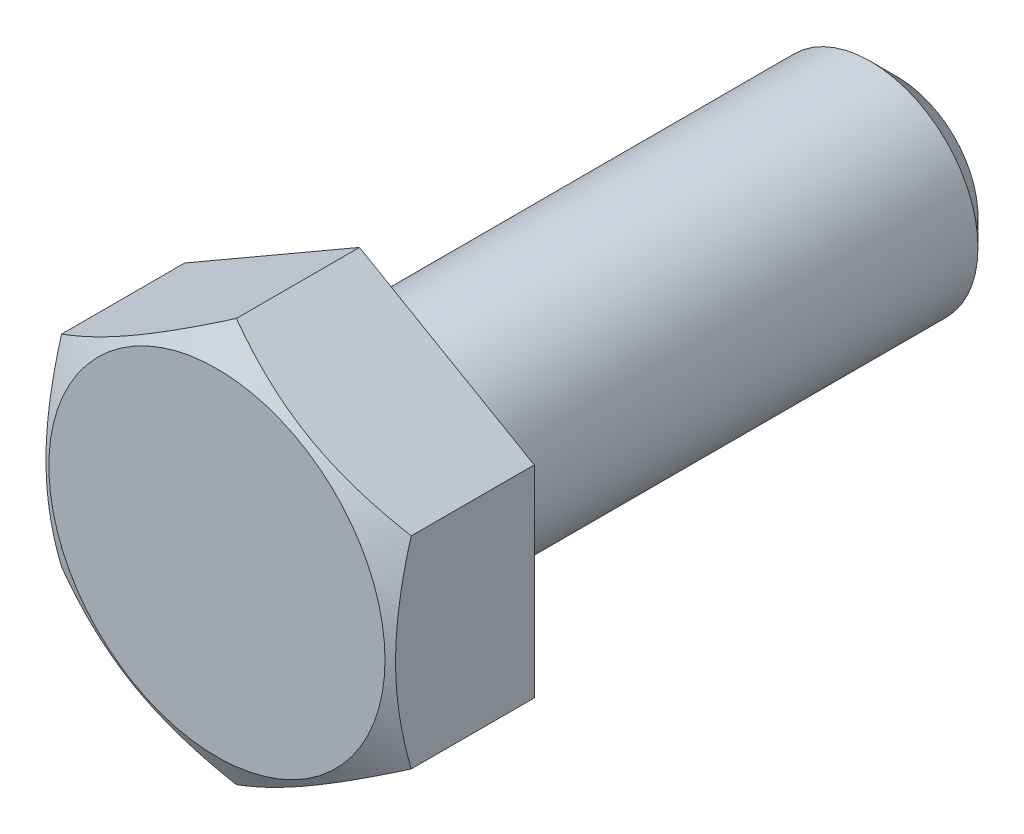
ISO-10303-21;
HEADER;
FILE_DESCRIPTION(('STEP AP214'),'2;1');
FILE_NAME('part.step','',(''),(''),'','','');
FILE_SCHEMA(('AUTOMOTIVE_DESIGN { 1 0 10303 214 1 1 1 1 }'));
ENDSEC;
DATA;
#1=APPLICATION_CONTEXT('core data for automotive mechanical design processes');
#2=APPLICATION_PROTOCOL_DEFINITION('international standard','automotive_design',2000,#1);
#3=PRODUCT_CONTEXT('',#1,'mechanical');
#4=PRODUCT('Part','Part','',(#3));
#5=PRODUCT_RELATED_PRODUCT_CATEGORY('part','',(#4));
#6=PRODUCT_DEFINITION_FORMATION('','',#4);
#7=PRODUCT_DEFINITION_CONTEXT('part definition',#1,'design');
#8=PRODUCT_DEFINITION('design','',#6,#7);
#9=PRODUCT_DEFINITION_SHAPE('','',#8);
#10=(LENGTH_UNIT() NAMED_UNIT(*) SI_UNIT(.MILLI.,.METRE.));
#11=(NAMED_UNIT(*) PLANE_ANGLE_UNIT() SI_UNIT($,.RADIAN.));
#12=(NAMED_UNIT(*) SI_UNIT($,.STERADIAN.) SOLID_ANGLE_UNIT());
#13=UNCERTAINTY_MEASURE_WITH_UNIT(LENGTH_MEASURE(1.E-05),#10,'distance_accuracy_value','');
#14=(GEOMETRIC_REPRESENTATION_CONTEXT(3) GLOBAL_UNCERTAINTY_ASSIGNED_CONTEXT((#13)) GLOBAL_UNIT_ASSIGNED_CONTEXT((#10,
#11,#12)) REPRESENTATION_CONTEXT('',''));
#15=CARTESIAN_POINT('',(0.,0.,0.));
#16=DIRECTION('',(0.,0.,1.));
#17=DIRECTION('',(1.,0.,0.));
#18=AXIS2_PLACEMENT_3D('',#15,#16,#17);
#19=CARTESIAN_POINT('',(0.,0.,0.));
#20=DIRECTION('',(0.,0.,1.));
#21=DIRECTION('',(1.,0.,0.));
#22=AXIS2_PLACEMENT_3D('',#19,#20,#21);
#23=PLANE('',#22);
#24=DIRECTION('',(-0.866025403784439,0.5,0.));
#25=VECTOR('',#24,1.);
#26=CARTESIAN_POINT('',(6.5,3.75277674973257,0.));
#27=LINE('',#26,#25);
#28=CARTESIAN_POINT('',(6.5,3.75277674973257,0.));
#29=VERTEX_POINT('',#28);
#30=CARTESIAN_POINT('',(0.,7.50555349946513,0.));
#31=VERTEX_POINT('',#30);
#32=EDGE_CURVE('E102',#29,#31,#27,.T.);
#33=ORIENTED_EDGE('',*,*,#32,.F.);
#34=DIRECTION('',(0.,1.,0.));
#35=VECTOR('',#34,1.);
#36=CARTESIAN_POINT('',(6.5,-3.75277674973257,0.));
#37=LINE('',#36,#35);
#38=CARTESIAN_POINT('',(6.5,-3.75277674973257,0.));
#39=VERTEX_POINT('',#38);
#40=EDGE_CURVE('E107',#39,#29,#37,.T.);
#41=ORIENTED_EDGE('',*,*,#40,.F.);
#42=DIRECTION('',(0.866025403784439,0.5,0.));
#43=VECTOR('',#42,1.);
#44=CARTESIAN_POINT('',(0.,-7.50555349946513,0.));
#45=LINE('',#44,#43);
#46=CARTESIAN_POINT('',(0.,-7.50555349946513,0.));
#47=VERTEX_POINT('',#46);
#48=EDGE_CURVE('E113',#47,#39,#45,.T.);
#49=ORIENTED_EDGE('',*,*,#48,.F.);
#50=DIRECTION('',(0.866025403784439,-0.5,0.));
#51=VECTOR('',#50,1.);
#52=CARTESIAN_POINT('',(-6.5,-3.75277674973257,0.));
#53=LINE('',#52,#51);
#54=CARTESIAN_POINT('',(-6.5,-3.75277674973257,0.));
#55=VERTEX_POINT('',#54);
#56=EDGE_CURVE('E224',#55,#47,#53,.T.);
#57=ORIENTED_EDGE('',*,*,#56,.F.);
#58=DIRECTION('',(0.,-1.,0.));
#59=VECTOR('',#58,1.);
#60=CARTESIAN_POINT('',(-6.5,3.75277674973257,0.));
#61=LINE('',#60,#59);
#62=CARTESIAN_POINT('',(-6.5,3.75277674973257,0.));
#63=VERTEX_POINT('',#62);
#64=EDGE_CURVE('E219',#63,#55,#61,.T.);
#65=ORIENTED_EDGE('',*,*,#64,.F.);
#66=DIRECTION('',(-0.866025403784439,-0.5,0.));
#67=VECTOR('',#66,1.);
#68=CARTESIAN_POINT('',(0.,7.50555349946513,0.));
#69=LINE('',#68,#67);
#70=EDGE_CURVE('E228',#31,#63,#69,.T.);
#71=ORIENTED_EDGE('',*,*,#70,.F.);
#72=EDGE_LOOP('',(#33,#41,#49,#57,#65,#71));
#73=FACE_BOUND('',#72,.T.);
#74=CARTESIAN_POINT('',(0.,0.,0.));
#75=DIRECTION('',(0.,0.,1.));
#76=DIRECTION('',(1.,0.,0.));
#77=AXIS2_PLACEMENT_3D('',#74,#75,#76);
#78=CIRCLE('',#77,4.);
#79=CARTESIAN_POINT('',(4.,0.,0.));
#80=VERTEX_POINT('',#79);
#81=EDGE_CURVE('E123',#80,#80,#78,.F.);
#82=ORIENTED_EDGE('',*,*,#81,.F.);
#83=EDGE_LOOP('',(#82));
#84=FACE_BOUND('',#83,.T.);
#85=ADVANCED_FACE('F39',(#73,#84),#23,.F.);
#86=CARTESIAN_POINT('',(6.5,3.75277674973257,5.3));
#87=DIRECTION('',(-0.5,-0.866025403784439,0.));
#88=DIRECTION('',(0.866025403784439,-0.5,0.));
#89=AXIS2_PLACEMENT_3D('',#86,#87,#88);
#90=PLANE('',#89);
#91=CARTESIAN_POINT('',(6.5002,3.75266127967873,4.57503918089673));
#92=CARTESIAN_POINT('',(6.35732254094112,3.8351516191275,4.62265800962711));
#93=CARTESIAN_POINT('',(6.21391236546508,3.91794952254312,4.66811573209989));
#94=CARTESIAN_POINT('',(5.9259273686828,4.08421773795795,4.75411375067955));
#95=CARTESIAN_POINT('',(5.78135207342873,4.16768832359105,4.79465192547457));
#96=CARTESIAN_POINT('',(5.34531134947996,4.41943655294051,4.90809143157939));
#97=CARTESIAN_POINT('',(5.05212471715368,4.5887079340369,4.97261462557386));
#98=CARTESIAN_POINT('',(4.61337625445562,4.84201947708215,5.0482758491551));
#99=CARTESIAN_POINT('',(4.46912536350531,4.92530276780316,5.06982957624561));
#100=CARTESIAN_POINT('',(4.17997178286191,5.09224566542477,5.10597211809648));
#101=CARTESIAN_POINT('',(4.03506915190111,5.17590523841627,5.12056154824293));
#102=CARTESIAN_POINT('',(3.74501222057168,5.34336968579964,5.14240368019525));
#103=CARTESIAN_POINT('',(3.59985839394579,5.427174286676,5.14966470838049));
#104=CARTESIAN_POINT('',(3.30942466302505,5.59485627940484,5.15670213012036));
#105=CARTESIAN_POINT('',(3.16414476276364,5.6787336689286,5.15647875489039));
#106=CARTESIAN_POINT('',(2.7661240575735,5.90853103021317,5.14557897418743));
#107=CARTESIAN_POINT('',(2.51351353897243,6.05437578112763,5.12728061483318));
#108=CARTESIAN_POINT('',(2.00997032176432,6.34509659313135,5.06925609124492));
#109=CARTESIAN_POINT('',(1.75903939406691,6.48997163178544,5.02951009416435));
#110=CARTESIAN_POINT('',(1.25448277935568,6.78127752911038,4.93015652950044));
#111=CARTESIAN_POINT('',(1.00092075856408,6.92767163007067,4.87012800706457));
#112=CARTESIAN_POINT('',(0.497578064240953,7.21827667013277,4.73388744019273));
#113=CARTESIAN_POINT('',(0.247790944447035,7.36249133098589,4.657707398539));
#114=CARTESIAN_POINT('',(-0.000200000000000559,7.50566896951897,4.57503918089673));
#115=B_SPLINE_CURVE_WITH_KNOTS('',3,(#91,#92,#93,#94,#95,#96,#97,#98,#99,#100,#101,#102,#103,
#104,#105,#106,#107,#108,#109,#110,#111,#112,#113,#114),.UNSPECIFIED.,.F.,.F.,(4,2,2,2,2,2,2,2,
2,2,2,4),(0.,0.515105052395587,1.03043143507524,2.06322554824262,2.56697389547996,
3.07067772176454,3.57380860368928,4.0769239424252,4.9527935470566,5.82947446853466,
6.72559912449736,7.61996451221045),.UNSPECIFIED.);
#116=CARTESIAN_POINT('',(6.5,3.75277674973257,4.57510584910183));
#117=VERTEX_POINT('',#116);
#118=CARTESIAN_POINT('',(0.,7.50555349946513,4.57510584910183));
#119=VERTEX_POINT('',#118);
#120=EDGE_CURVE('E93',#117,#119,#115,.T.);
#121=ORIENTED_EDGE('',*,*,#120,.F.);
#122=DIRECTION('',(0.,0.,-1.));
#123=VECTOR('',#122,1.);
#124=CARTESIAN_POINT('',(6.5,3.75277674973257,5.3));
#125=LINE('',#124,#123);
#126=EDGE_CURVE('E62',#117,#29,#125,.T.);
#127=ORIENTED_EDGE('',*,*,#126,.T.);
#128=ORIENTED_EDGE('',*,*,#32,.T.);
#129=DIRECTION('',(0.,0.,-1.));
#130=VECTOR('',#129,1.);
#131=CARTESIAN_POINT('',(0.,7.50555349946513,5.3));
#132=LINE('',#131,#130);
#133=EDGE_CURVE('E101',#119,#31,#132,.T.);
#134=ORIENTED_EDGE('',*,*,#133,.F.);
#135=EDGE_LOOP('',(#121,#127,#128,#134));
#136=FACE_BOUND('',#135,.T.);
#137=ADVANCED_FACE('F100',(#136),#90,.F.);
#138=CARTESIAN_POINT('',(0.,7.50555349946513,5.3));
#139=DIRECTION('',(0.5,-0.866025403784439,0.));
#140=DIRECTION('',(0.866025403784439,0.5,0.));
#141=AXIS2_PLACEMENT_3D('',#138,#139,#140);
#142=PLANE('',#141);
#143=CARTESIAN_POINT('',(0.000199999999999772,7.50566896951897,4.57503918089673));
#144=CARTESIAN_POINT('',(-0.142677459058881,7.4231786300702,4.62265800962711));
#145=CARTESIAN_POINT('',(-0.286087634534913,7.34038072665458,4.66811573209989));
#146=CARTESIAN_POINT('',(-0.574072631317195,7.17411251123976,4.75411375067955));
#147=CARTESIAN_POINT('',(-0.718647926571264,7.09064192560665,4.79465192547457));
#148=CARTESIAN_POINT('',(-1.15468865052003,6.83889369625719,4.90809143157939));
#149=CARTESIAN_POINT('',(-1.44787528284632,6.66962231516081,4.97261462557386));
#150=CARTESIAN_POINT('',(-1.88662374554437,6.41631077211555,5.0482758491551));
#151=CARTESIAN_POINT('',(-2.03087463649469,6.33302748139454,5.06982957624561));
#152=CARTESIAN_POINT('',(-2.32002821713809,6.16608458377293,5.10597211809648));
#153=CARTESIAN_POINT('',(-2.46493084809889,6.08242501078143,5.12056154824293));
#154=CARTESIAN_POINT('',(-2.75498777942832,5.91496056339806,5.14240368019525));
#155=CARTESIAN_POINT('',(-2.90014160605421,5.8311559625217,5.14966470838049));
#156=CARTESIAN_POINT('',(-3.19057533697495,5.66347396979287,5.15670213012036));
#157=CARTESIAN_POINT('',(-3.33585523723636,5.5795965802691,5.15647875489039));
#158=CARTESIAN_POINT('',(-3.73387594242649,5.34979921898453,5.14557897418743));
#159=CARTESIAN_POINT('',(-3.98648646102757,5.20395446807007,5.12728061483318));
#160=CARTESIAN_POINT('',(-4.49002967823568,4.91323365606636,5.06925609124492));
#161=CARTESIAN_POINT('',(-4.74096060593308,4.76835861741226,5.02951009416435));
#162=CARTESIAN_POINT('',(-5.24551722064432,4.47705272008732,4.93015652950044));
#163=CARTESIAN_POINT('',(-5.49907924143591,4.33065861912703,4.87012800706457));
#164=CARTESIAN_POINT('',(-6.00242193575904,4.04005357906494,4.73388744019273));
#165=CARTESIAN_POINT('',(-6.25220905555296,3.89583891821182,4.657707398539));
#166=CARTESIAN_POINT('',(-6.5002,3.75266127967873,4.57503918089673));
#167=B_SPLINE_CURVE_WITH_KNOTS('',3,(#143,#144,#145,#146,#147,#148,#149,#150,#151,#152,#153,
#154,#155,#156,#157,#158,#159,#160,#161,#162,#163,#164,#165,#166),.UNSPECIFIED.,.F.,.F.,(4,2,2,
2,2,2,2,2,2,2,2,4),(0.,0.515105052395588,1.03043143507524,2.06322554824262,2.56697389547996,
3.07067772176454,3.57380860368928,4.0769239424252,4.9527935470566,5.82947446853466,
6.72559912449736,7.61996451221046),.UNSPECIFIED.);
#168=CARTESIAN_POINT('',(-6.5,3.75277674973257,4.57510584910183));
#169=VERTEX_POINT('',#168);
#170=EDGE_CURVE('E103',#119,#169,#167,.T.);
#171=ORIENTED_EDGE('',*,*,#170,.F.);
#172=ORIENTED_EDGE('',*,*,#133,.T.);
#173=ORIENTED_EDGE('',*,*,#70,.T.);
#174=DIRECTION('',(0.,0.,-1.));
#175=VECTOR('',#174,1.);
#176=CARTESIAN_POINT('',(-6.5,3.75277674973257,5.3));
#177=LINE('',#176,#175);
#178=EDGE_CURVE('E120',#169,#63,#177,.T.);
#179=ORIENTED_EDGE('',*,*,#178,.F.);
#180=EDGE_LOOP('',(#171,#172,#173,#179));
#181=FACE_BOUND('',#180,.T.);
#182=ADVANCED_FACE('F144',(#181),#142,.F.);
#183=CARTESIAN_POINT('',(-6.5,3.75277674973257,5.3));
#184=DIRECTION('',(1.,0.,0.));
#185=DIRECTION('',(0.,0.,-1.));
#186=AXIS2_PLACEMENT_3D('',#183,#184,#185);
#187=PLANE('',#186);
#188=CARTESIAN_POINT('',(-6.5,-10.1964031930489,1.92711557165721));
#189=CARTESIAN_POINT('',(-6.5,-9.91146706252512,2.06579754355137));
#190=CARTESIAN_POINT('',(-6.5,-9.62588907457074,2.20318274861047));
#191=CARTESIAN_POINT('',(-6.5,-9.05310840022942,2.47463240106079));
#192=CARTESIAN_POINT('',(-6.5,-8.76590547628142,2.60869634663158));
#193=CARTESIAN_POINT('',(-6.5,-8.18810963339234,2.87342586157266));
#194=CARTESIAN_POINT('',(-6.5,-7.89750683697914,3.00406994488669));
#195=CARTESIAN_POINT('',(-6.5,-7.31402958895834,3.26016311775927));
#196=CARTESIAN_POINT('',(-6.5,-7.02115524220785,3.38561244543842));
#197=CARTESIAN_POINT('',(-6.5,-6.42287342665227,3.63401536482613));
#198=CARTESIAN_POINT('',(-6.5,-6.11737326861938,3.75674689735945));
#199=CARTESIAN_POINT('',(-6.5,-5.50284186470128,3.99319880427273));
#200=CARTESIAN_POINT('',(-6.5,-5.19381023341625,4.10691818417453));
#201=CARTESIAN_POINT('',(-6.5,-4.57226679200279,4.32244612814773));
#202=CARTESIAN_POINT('',(-6.5,-4.25976307613069,4.4242778102538));
#203=CARTESIAN_POINT('',(-6.5,-3.63027121398134,4.61283895840874));
#204=CARTESIAN_POINT('',(-6.5,-3.31328447599402,4.69957305804761));
#205=CARTESIAN_POINT('',(-6.5,-2.67639712557225,4.85340222686151));
#206=CARTESIAN_POINT('',(-6.5,-2.3565229810901,4.92060515873457));
#207=CARTESIAN_POINT('',(-6.5,-1.71263332307702,5.03162587527321));
#208=CARTESIAN_POINT('',(-6.5,-1.38861825600943,5.07544615957369));
#209=CARTESIAN_POINT('',(-6.5,-0.90293972852367,5.12073543049099));
#210=CARTESIAN_POINT('',(-6.5,-0.742189550322453,5.13241333858599));
#211=CARTESIAN_POINT('',(-6.5,-0.420332063816456,5.14896113908469));
#212=CARTESIAN_POINT('',(-6.5,-0.259224761667658,5.15383114794059));
#213=CARTESIAN_POINT('',(-6.5,0.0630511216418176,5.15663919673593));
#214=CARTESIAN_POINT('',(-6.5,0.224219703305156,5.15457717853122));
#215=CARTESIAN_POINT('',(-6.5,0.546324268949108,5.14357483116284));
#216=CARTESIAN_POINT('',(-6.5,0.707260241688987,5.1346341800386));
#217=CARTESIAN_POINT('',(-6.5,1.09049506880968,5.10534524526755));
#218=CARTESIAN_POINT('',(-6.5,1.31256476986377,5.08193031415322));
#219=CARTESIAN_POINT('',(-6.5,1.75512160628943,5.02325347502964));
#220=CARTESIAN_POINT('',(-6.5,1.97560853645986,4.98799005825506));
#221=CARTESIAN_POINT('',(-6.5,2.63439856988161,4.86629161806814));
#222=CARTESIAN_POINT('',(-6.5,3.06980900545459,4.76396766778308));
#223=CARTESIAN_POINT('',(-6.5,3.72118788096864,4.58565121984061));
#224=CARTESIAN_POINT('',(-6.5,3.94050855697565,4.5211929338711));
#225=CARTESIAN_POINT('',(-6.5,4.37702114158928,4.38536743656224));
#226=CARTESIAN_POINT('',(-6.5,4.59421303390638,4.31400017240058));
#227=CARTESIAN_POINT('',(-6.5,5.02653508607764,4.1655196367425));
#228=CARTESIAN_POINT('',(-6.5,5.24166582474598,4.08840803513156));
#229=CARTESIAN_POINT('',(-6.5,5.67012789403292,3.92936761306644));
#230=CARTESIAN_POINT('',(-6.5,5.88345926514816,3.8474389013589));
#231=CARTESIAN_POINT('',(-6.5,6.45686419323843,3.62098197309385));
#232=CARTESIAN_POINT('',(-6.5,6.81544214889601,3.4726704145426));
#233=CARTESIAN_POINT('',(-6.5,7.52892619030864,3.16743287773286));
#234=CARTESIAN_POINT('',(-6.5,7.88383187065143,3.0105059601635));
#235=CARTESIAN_POINT('',(-6.5,8.59081374128433,2.69007555499517));
#236=CARTESIAN_POINT('',(-6.5,8.94288881107286,2.52656960336644));
#237=CARTESIAN_POINT('',(-6.5,9.64464600542362,2.19455308073868));
#238=CARTESIAN_POINT('',(-6.5,9.9943282251893,2.02604271028996));
#239=CARTESIAN_POINT('',(-6.5,10.6923270252369,1.68483568484166));
#240=CARTESIAN_POINT('',(-6.5,11.0406405627199,1.51213281824188));
#241=CARTESIAN_POINT('',(-6.5,11.7357056494374,1.16361011170295));
#242=CARTESIAN_POINT('',(-6.5,12.0824571858439,0.987790246223629));
#243=CARTESIAN_POINT('',(-6.5,12.7746015421308,0.633683743777883));
#244=CARTESIAN_POINT('',(-6.5,13.1199946416679,0.455397652787269));
#245=CARTESIAN_POINT('',(-6.5,13.8097189165945,0.0967819278551111));
#246=CARTESIAN_POINT('',(-6.5,14.1540500877756,-0.0835477141718704));
#247=CARTESIAN_POINT('',(-6.5,15.1131791649223,-0.588833427630172));
#248=CARTESIAN_POINT('',(-6.5,15.7270059152904,-0.915632545673792));
#249=CARTESIAN_POINT('',(-6.5,16.9526102543151,-1.57313126938156));
#250=CARTESIAN_POINT('',(-6.5,17.5643877160335,-1.90383111113284));
#251=CARTESIAN_POINT('',(-6.5,18.7843432470106,-2.56703187359179));
#252=CARTESIAN_POINT('',(-6.5,19.3925265283063,-2.89952321614154));
#253=CARTESIAN_POINT('',(-6.5,20.6076120788137,-3.56672759971615));
#254=CARTESIAN_POINT('',(-6.5,21.2145144440943,-3.90144046571286));
#255=CARTESIAN_POINT('',(-6.5,21.8209669709978,-4.23696051415545));
#256=B_SPLINE_CURVE_WITH_KNOTS('',3,(#188,#189,#190,#191,#192,#193,#194,#195,#196,#197,#198,
#199,#200,#201,#202,#203,#204,#205,#206,#207,#208,#209,#210,#211,#212,#213,#214,#215,#216,#217,
#218,#219,#220,#221,#222,#223,#224,#225,#226,#227,#228,#229,#230,#231,#232,#233,#234,#235,#236,
#237,#238,#239,#240,#241,#242,#243,#244,#245,#246,#247,#248,#249,#250,#251,#252,#253,#254,#255),
.UNSPECIFIED.,.F.,.F.,(4,2,2,2,2,2,2,2,2,2,2,2,2,2,2,2,2,2,2,2,2,2,2,2,2,2,2,2,2,2,2,2,2,4),(0.,
0.950690619419343,1.90152401651383,2.85733928389556,3.81311068938182,4.80069533328718,
5.78838880444144,6.77412832781171,7.75956478298498,8.73945089917041,9.71923224328163,
10.2026314085953,10.6860223050466,11.1694172560735,11.6528348342104,12.3223614428188,
12.9919733400987,14.3318623515428,15.0175917928263,15.7033264772407,16.3888625899154,
17.0743832324966,18.2383326098106,19.4024091425865,20.5669257879766,21.7313958285828,
22.8977114506331,24.0640366337077,25.2301076202752,26.3961832220869,28.4823609421224,
30.5686655804134,32.6480679984329,34.7273084857545),.UNSPECIFIED.);
#257=CARTESIAN_POINT('',(-6.5,-3.75277674973257,4.57510584910183));
#258=VERTEX_POINT('',#257);
#259=EDGE_CURVE('E188',#169,#258,#256,.F.);
#260=ORIENTED_EDGE('',*,*,#259,.F.);
#261=ORIENTED_EDGE('',*,*,#178,.T.);
#262=ORIENTED_EDGE('',*,*,#64,.T.);
#263=DIRECTION('',(0.,0.,-1.));
#264=VECTOR('',#263,1.);
#265=CARTESIAN_POINT('',(-6.5,-3.75277674973257,5.3));
#266=LINE('',#265,#264);
#267=EDGE_CURVE('E118',#258,#55,#266,.T.);
#268=ORIENTED_EDGE('',*,*,#267,.F.);
#269=EDGE_LOOP('',(#260,#261,#262,#268));
#270=FACE_BOUND('',#269,.T.);
#271=ADVANCED_FACE('F199',(#270),#187,.F.);
#272=CARTESIAN_POINT('',(-6.5,-3.75277674973257,5.3));
#273=DIRECTION('',(0.5,0.866025403784439,0.));
#274=DIRECTION('',(-0.866025403784439,0.5,0.));
#275=AXIS2_PLACEMENT_3D('',#272,#273,#274);
#276=PLANE('',#275);
#277=CARTESIAN_POINT('',(-6.5002,-3.75266127967873,4.57503918089673));
#278=CARTESIAN_POINT('',(-6.35732254094112,-3.8351516191275,4.62265800962711));
#279=CARTESIAN_POINT('',(-6.21391236546509,-3.91794952254312,4.66811573209989));
#280=CARTESIAN_POINT('',(-5.9259273686828,-4.08421773795795,4.75411375067955));
#281=CARTESIAN_POINT('',(-5.78135207342873,-4.16768832359105,4.79465192547457));
#282=CARTESIAN_POINT('',(-5.34531134947996,-4.41943655294051,4.90809143157939));
#283=CARTESIAN_POINT('',(-5.05212471715368,-4.5887079340369,4.97261462557386));
#284=CARTESIAN_POINT('',(-4.61337625445563,-4.84201947708215,5.0482758491551));
#285=CARTESIAN_POINT('',(-4.46912536350531,-4.92530276780316,5.06982957624561));
#286=CARTESIAN_POINT('',(-4.17997178286191,-5.09224566542477,5.10597211809648));
#287=CARTESIAN_POINT('',(-4.03506915190111,-5.17590523841627,5.12056154824293));
#288=CARTESIAN_POINT('',(-3.74501222057168,-5.34336968579964,5.14240368019525));
#289=CARTESIAN_POINT('',(-3.59985839394579,-5.427174286676,5.14966470838049));
#290=CARTESIAN_POINT('',(-3.30942466302505,-5.59485627940484,5.15670213012036));
#291=CARTESIAN_POINT('',(-3.16414476276364,-5.6787336689286,5.15647875489039));
#292=CARTESIAN_POINT('',(-2.76612405757351,-5.90853103021317,5.14557897418743));
#293=CARTESIAN_POINT('',(-2.51351353897243,-6.05437578112763,5.12728061483318));
#294=CARTESIAN_POINT('',(-2.00997032176432,-6.34509659313134,5.06925609124492));
#295=CARTESIAN_POINT('',(-1.75903939406692,-6.48997163178544,5.02951009416435));
#296=CARTESIAN_POINT('',(-1.25448277935568,-6.78127752911038,4.93015652950044));
#297=CARTESIAN_POINT('',(-1.00092075856409,-6.92767163007067,4.87012800706457));
#298=CARTESIAN_POINT('',(-0.497578064240957,-7.21827667013277,4.73388744019273));
#299=CARTESIAN_POINT('',(-0.247790944447038,-7.36249133098589,4.657707398539));
#300=CARTESIAN_POINT('',(0.000199999999997799,-7.50566896951897,4.57503918089673));
#301=B_SPLINE_CURVE_WITH_KNOTS('',3,(#277,#278,#279,#280,#281,#282,#283,#284,#285,#286,#287,
#288,#289,#290,#291,#292,#293,#294,#295,#296,#297,#298,#299,#300),.UNSPECIFIED.,.F.,.F.,(4,2,2,
2,2,2,2,2,2,2,2,4),(0.,0.515105052395587,1.03043143507524,2.06322554824262,2.56697389547996,
3.07067772176454,3.57380860368928,4.0769239424252,4.9527935470566,5.82947446853466,
6.72559912449736,7.61996451221045),.UNSPECIFIED.);
#302=CARTESIAN_POINT('',(0.,-7.50555349946513,4.57510584910183));
#303=VERTEX_POINT('',#302);
#304=EDGE_CURVE('E182',#258,#303,#301,.T.);
#305=ORIENTED_EDGE('',*,*,#304,.F.);
#306=ORIENTED_EDGE('',*,*,#267,.T.);
#307=ORIENTED_EDGE('',*,*,#56,.T.);
#308=DIRECTION('',(0.,0.,-1.));
#309=VECTOR('',#308,1.);
#310=CARTESIAN_POINT('',(0.,-7.50555349946513,5.3));
#311=LINE('',#310,#309);
#312=EDGE_CURVE('E111',#303,#47,#311,.T.);
#313=ORIENTED_EDGE('',*,*,#312,.F.);
#314=EDGE_LOOP('',(#305,#306,#307,#313));
#315=FACE_BOUND('',#314,.T.);
#316=ADVANCED_FACE('F202',(#315),#276,.F.);
#317=CARTESIAN_POINT('',(0.,-7.50555349946513,5.3));
#318=DIRECTION('',(-0.5,0.866025403784439,0.));
#319=DIRECTION('',(-0.866025403784439,-0.5,0.));
#320=AXIS2_PLACEMENT_3D('',#317,#318,#319);
#321=PLANE('',#320);
#322=CARTESIAN_POINT('',(-0.000200000000002833,-7.50566896951897,4.57503918089673));
#323=CARTESIAN_POINT('',(0.142677459058877,-7.4231786300702,4.62265800962711));
#324=CARTESIAN_POINT('',(0.28608763453491,-7.34038072665458,4.66811573209989));
#325=CARTESIAN_POINT('',(0.574072631317192,-7.17411251123975,4.75411375067955));
#326=CARTESIAN_POINT('',(0.718647926571261,-7.09064192560665,4.79465192547457));
#327=CARTESIAN_POINT('',(1.15468865052003,-6.83889369625719,4.90809143157939));
#328=CARTESIAN_POINT('',(1.44787528284632,-6.66962231516081,4.97261462557386));
#329=CARTESIAN_POINT('',(1.88662374554437,-6.41631077211555,5.0482758491551));
#330=CARTESIAN_POINT('',(2.03087463649469,-6.33302748139454,5.06982957624561));
#331=CARTESIAN_POINT('',(2.32002821713809,-6.16608458377293,5.10597211809648));
#332=CARTESIAN_POINT('',(2.46493084809889,-6.08242501078143,5.12056154824293));
#333=CARTESIAN_POINT('',(2.75498777942832,-5.91496056339806,5.14240368019525));
#334=CARTESIAN_POINT('',(2.90014160605421,-5.8311559625217,5.14966470838049));
#335=CARTESIAN_POINT('',(3.19057533697495,-5.66347396979287,5.15670213012036));
#336=CARTESIAN_POINT('',(3.33585523723636,-5.5795965802691,5.15647875489039));
#337=CARTESIAN_POINT('',(3.73387594242649,-5.34979921898453,5.14557897418743));
#338=CARTESIAN_POINT('',(3.98648646102757,-5.20395446807007,5.12728061483318));
#339=CARTESIAN_POINT('',(4.49002967823568,-4.91323365606636,5.06925609124492));
#340=CARTESIAN_POINT('',(4.74096060593308,-4.76835861741226,5.02951009416435));
#341=CARTESIAN_POINT('',(5.24551722064432,-4.47705272008732,4.93015652950045));
#342=CARTESIAN_POINT('',(5.49907924143591,-4.33065861912703,4.87012800706457));
#343=CARTESIAN_POINT('',(6.00242193575904,-4.04005357906494,4.73388744019273));
#344=CARTESIAN_POINT('',(6.25220905555296,-3.89583891821182,4.657707398539));
#345=CARTESIAN_POINT('',(6.5002,-3.75266127967873,4.57503918089673));
#346=B_SPLINE_CURVE_WITH_KNOTS('',3,(#322,#323,#324,#325,#326,#327,#328,#329,#330,#331,#332,
#333,#334,#335,#336,#337,#338,#339,#340,#341,#342,#343,#344,#345),.UNSPECIFIED.,.F.,.F.,(4,2,2,
2,2,2,2,2,2,2,2,4),(0.,0.515105052395588,1.03043143507524,2.06322554824262,2.56697389547996,
3.07067772176454,3.57380860368928,4.0769239424252,4.9527935470566,5.82947446853466,
6.72559912449736,7.61996451221046),.UNSPECIFIED.);
#347=CARTESIAN_POINT('',(6.5,-3.75277674973257,4.57510584910183));
#348=VERTEX_POINT('',#347);
#349=EDGE_CURVE('E54',#303,#348,#346,.T.);
#350=ORIENTED_EDGE('',*,*,#349,.F.);
#351=ORIENTED_EDGE('',*,*,#312,.T.);
#352=ORIENTED_EDGE('',*,*,#48,.T.);
#353=DIRECTION('',(0.,0.,-1.));
#354=VECTOR('',#353,1.);
#355=CARTESIAN_POINT('',(6.5,-3.75277674973257,5.3));
#356=LINE('',#355,#354);
#357=EDGE_CURVE('E109',#348,#39,#356,.T.);
#358=ORIENTED_EDGE('',*,*,#357,.F.);
#359=EDGE_LOOP('',(#350,#351,#352,#358));
#360=FACE_BOUND('',#359,.T.);
#361=ADVANCED_FACE('F153',(#360),#321,.F.);
#362=CARTESIAN_POINT('',(6.5,-3.75277674973257,5.3));
#363=DIRECTION('',(-1.,0.,0.));
#364=DIRECTION('',(0.,-1.,0.));
#365=AXIS2_PLACEMENT_3D('',#362,#363,#364);
#366=PLANE('',#365);
#367=CARTESIAN_POINT('',(6.5,-10.1964031963921,1.92711557002958));
#368=CARTESIAN_POINT('',(6.5,-9.91146706575583,2.06579754199164));
#369=CARTESIAN_POINT('',(6.5,-9.62588907768882,2.20318274711861));
#370=CARTESIAN_POINT('',(6.5,-9.05310840312192,2.47463239970435));
#371=CARTESIAN_POINT('',(6.5,-8.76590547906097,2.60869634534268));
#372=CARTESIAN_POINT('',(6.5,-8.18810963594424,2.87342586041888));
#373=CARTESIAN_POINT('',(6.5,-7.89750683941635,3.00406994380048));
#374=CARTESIAN_POINT('',(6.5,-7.31402959116539,3.26016311680708));
#375=CARTESIAN_POINT('',(6.5,-7.02115524429944,3.38561244455269));
#376=CARTESIAN_POINT('',(6.5,-6.42287342850399,3.63401536407521));
#377=CARTESIAN_POINT('',(6.5,-6.11737327034664,3.75674689667674));
#378=CARTESIAN_POINT('',(6.5,-5.50284186617759,3.99319880372282));
#379=CARTESIAN_POINT('',(6.5,-5.19381023476609,4.1069181836892));
#380=CARTESIAN_POINT('',(6.5,-4.57226679309735,4.3224461277854));
#381=CARTESIAN_POINT('',(6.5,-4.25976307709645,4.42427780994992));
#382=CARTESIAN_POINT('',(6.5,-3.63027121468599,4.61283895821224));
#383=CARTESIAN_POINT('',(6.5,-3.31328447656636,4.69957305790006));
#384=CARTESIAN_POINT('',(6.5,-2.67639712581227,4.85340222681279));
#385=CARTESIAN_POINT('',(6.5,-2.35652298112919,4.92060515873196));
#386=CARTESIAN_POINT('',(6.5,-1.71263332270929,5.0316258753325));
#387=CARTESIAN_POINT('',(6.5,-1.3886182554358,5.07544615964879));
#388=CARTESIAN_POINT('',(6.5,-0.902939727642646,5.12073543056245));
#389=CARTESIAN_POINT('',(6.5,-0.742189549340452,5.13241333865179));
#390=CARTESIAN_POINT('',(6.5,-0.420332062632674,5.14896113913027));
#391=CARTESIAN_POINT('',(6.5,-0.259224760383073,5.15383114797159));
#392=CARTESIAN_POINT('',(6.5,0.0630511231272613,5.15663919672905));
#393=CARTESIAN_POINT('',(6.5,0.224219704890654,5.15457717850103));
#394=CARTESIAN_POINT('',(6.5,0.546324270733419,5.14357483107791));
#395=CARTESIAN_POINT('',(6.5,0.707260243572055,5.13463417992224));
#396=CARTESIAN_POINT('',(6.5,1.09049507084486,5.1053452450739));
#397=CARTESIAN_POINT('',(6.5,1.31256477195186,5.08193031391512));
#398=CARTESIAN_POINT('',(6.5,1.75512160848097,5.02325347470026));
#399=CARTESIAN_POINT('',(6.5,1.97560853870191,4.98799005787886));
#400=CARTESIAN_POINT('',(6.5,2.63439857227244,4.8662916175505));
#401=CARTESIAN_POINT('',(6.5,3.06980900794069,4.76396766716991));
#402=CARTESIAN_POINT('',(6.5,3.72118788359726,4.58565121908648));
#403=CARTESIAN_POINT('',(6.5,3.94050855965281,4.52119293306965));
#404=CARTESIAN_POINT('',(6.5,4.37702114436295,4.38536743566762));
#405=CARTESIAN_POINT('',(6.5,4.59421303672804,4.3140001714601));
#406=CARTESIAN_POINT('',(6.5,5.02653508899492,4.16551963571194));
#407=CARTESIAN_POINT('',(6.5,5.24166582771088,4.08840803405679));
#408=CARTESIAN_POINT('',(6.5,5.67012789709309,3.9293676119048));
#409=CARTESIAN_POINT('',(6.5,5.88345926825596,3.8474389001546));
#410=CARTESIAN_POINT('',(6.5,6.45686419637332,3.62098197181646));
#411=CARTESIAN_POINT('',(6.5,6.81544215201176,3.4726704132394));
#412=CARTESIAN_POINT('',(6.5,7.52892619338857,3.16743287638554));
#413=CARTESIAN_POINT('',(6.5,7.88383187371468,3.01050595879786));
#414=CARTESIAN_POINT('',(6.5,8.59081374431601,2.69007555359836));
#415=CARTESIAN_POINT('',(6.5,8.94288881408965,2.52656960195676));
#416=CARTESIAN_POINT('',(6.5,9.64464600841221,2.19455307930711));
#417=CARTESIAN_POINT('',(6.5,9.9943282281646,2.02604270884935));
#418=CARTESIAN_POINT('',(6.5,10.692327028186,1.68483568338619));
#419=CARTESIAN_POINT('',(6.5,11.0406405656562,1.51213281678058));
#420=CARTESIAN_POINT('',(6.5,11.7357056523488,1.16361011023212));
#421=CARTESIAN_POINT('',(6.5,12.0824571887433,0.987790244749081));
#422=CARTESIAN_POINT('',(6.5,12.7746015450073,0.633683742297424));
#423=CARTESIAN_POINT('',(6.49999999999999,13.1199946445333,0.455397651304614));
#424=CARTESIAN_POINT('',(6.49999999999999,13.8097189194384,0.0967819263692756));
#425=CARTESIAN_POINT('',(6.49999999999999,14.154050090609,-0.0835477156586897));
#426=CARTESIAN_POINT('',(6.49999999999999,15.113179167745,-0.588833429127821));
#427=CARTESIAN_POINT('',(6.49999999999999,15.7270059181133,-0.915632547180414));
#428=CARTESIAN_POINT('',(6.49999999999999,16.9526102571392,-1.57313127090433));
#429=CARTESIAN_POINT('',(6.49999999999999,17.5643877188586,-1.9038311126628));
#430=CARTESIAN_POINT('',(6.49999999999999,18.7843432498413,-2.56703187513649));
#431=CARTESIAN_POINT('',(6.49999999999999,19.3925265311416,-2.89952321769382));
#432=CARTESIAN_POINT('',(6.49999999999999,20.6076120816587,-3.56672760128277));
#433=CARTESIAN_POINT('',(6.49999999999999,21.2145144469444,-3.90144046728626));
#434=CARTESIAN_POINT('',(6.49999999999999,21.8209669738531,-4.23696051573536));
#435=B_SPLINE_CURVE_WITH_KNOTS('',3,(#367,#368,#369,#370,#371,#372,#373,#374,#375,#376,#377,
#378,#379,#380,#381,#382,#383,#384,#385,#386,#387,#388,#389,#390,#391,#392,#393,#394,#395,#396,
#397,#398,#399,#400,#401,#402,#403,#404,#405,#406,#407,#408,#409,#410,#411,#412,#413,#414,#415,
#416,#417,#418,#419,#420,#421,#422,#423,#424,#425,#426,#427,#428,#429,#430,#431,#432,#433,#434),
.UNSPECIFIED.,.F.,.F.,(4,2,2,2,2,2,2,2,2,2,2,2,2,2,2,2,2,2,2,2,2,2,2,2,2,2,2,2,2,2,2,2,2,4),(0.,
0.950690619812072,1.90152401729934,2.85733928507801,3.81311069096117,4.80069533528928,
5.78838880686643,6.7741283306582,7.75956478625263,8.73945090305517,9.71923224778258,
10.2026314133969,10.6860223101489,11.1694172614765,11.6528348399143,12.3223614486944,
12.9919733461461,14.3318623579345,15.0175917993978,15.703326483992,16.388862596846,
17.0743832396065,18.2383326168974,19.4024091496498,20.5669257950157,21.7313958355979,
22.8977114576212,24.064036640669,25.23010762721,26.3961832289953,28.482360949044,
30.5686655873478,32.6480680053903,34.7273084927351),.UNSPECIFIED.);
#436=EDGE_CURVE('E91',#348,#117,#435,.T.);
#437=ORIENTED_EDGE('',*,*,#436,.F.);
#438=ORIENTED_EDGE('',*,*,#357,.T.);
#439=ORIENTED_EDGE('',*,*,#40,.T.);
#440=ORIENTED_EDGE('',*,*,#126,.F.);
#441=EDGE_LOOP('',(#437,#438,#439,#440));
#442=FACE_BOUND('',#441,.T.);
#443=ADVANCED_FACE('F105',(#442),#366,.F.);
#444=CARTESIAN_POINT('',(0.,0.,5.3));
#445=DIRECTION('',(0.,0.,-1.));
#446=DIRECTION('',(1.,0.,0.));
#447=AXIS2_PLACEMENT_3D('',#444,#445,#446);
#448=CONICAL_SURFACE('',#447,6.25,1.0471975511966);
#449=CARTESIAN_POINT('',(0.,0.,5.3));
#450=DIRECTION('',(0.,0.,1.));
#451=DIRECTION('',(1.,0.,0.));
#452=AXIS2_PLACEMENT_3D('',#449,#450,#451);
#453=CIRCLE('',#452,6.25);
#454=CARTESIAN_POINT('',(6.25,0.,5.3));
#455=VERTEX_POINT('',#454);
#456=EDGE_CURVE('E97',#455,#455,#453,.T.);
#457=ORIENTED_EDGE('',*,*,#456,.F.);
#458=EDGE_LOOP('',(#457));
#459=FACE_BOUND('',#458,.T.);
#460=ORIENTED_EDGE('',*,*,#120,.T.);
#461=ORIENTED_EDGE('',*,*,#170,.T.);
#462=ORIENTED_EDGE('',*,*,#259,.T.);
#463=ORIENTED_EDGE('',*,*,#304,.T.);
#464=ORIENTED_EDGE('',*,*,#349,.T.);
#465=ORIENTED_EDGE('',*,*,#436,.T.);
#466=EDGE_LOOP('',(#460,#461,#462,#463,#464,#465));
#467=FACE_BOUND('',#466,.T.);
#468=ADVANCED_FACE('F92',(#459,#467),#448,.T.);
#469=CARTESIAN_POINT('',(0.,0.,5.3));
#470=DIRECTION('',(0.,0.,1.));
#471=DIRECTION('',(1.,0.,0.));
#472=AXIS2_PLACEMENT_3D('',#469,#470,#471);
#473=PLANE('',#472);
#474=ORIENTED_EDGE('',*,*,#456,.T.);
#475=EDGE_LOOP('',(#474));
#476=FACE_BOUND('',#475,.T.);
#477=ADVANCED_FACE('F148',(#476),#473,.T.);
#478=CARTESIAN_POINT('',(0.,0.,-20.));
#479=DIRECTION('',(0.,0.,1.));
#480=DIRECTION('',(1.,0.,0.));
#481=AXIS2_PLACEMENT_3D('',#478,#479,#480);
#482=CYLINDRICAL_SURFACE('',#481,4.);
#483=CARTESIAN_POINT('',(0.,0.,-19.));
#484=DIRECTION('',(0.,0.,-1.));
#485=DIRECTION('',(-1.,0.,0.));
#486=AXIS2_PLACEMENT_3D('',#483,#484,#485);
#487=CIRCLE('',#486,4.);
#488=CARTESIAN_POINT('',(-4.,0.,-19.));
#489=VERTEX_POINT('',#488);
#490=EDGE_CURVE('E12',#489,#489,#487,.F.);
#491=ORIENTED_EDGE('',*,*,#490,.T.);
#492=EDGE_LOOP('',(#491));
#493=FACE_BOUND('',#492,.T.);
#494=ORIENTED_EDGE('',*,*,#81,.T.);
#495=EDGE_LOOP('',(#494));
#496=FACE_BOUND('',#495,.T.);
#497=ADVANCED_FACE('F135',(#493,#496),#482,.T.);
#498=CARTESIAN_POINT('',(0.,0.,-20.));
#499=DIRECTION('',(0.,0.,-1.));
#500=DIRECTION('',(-1.,0.,0.));
#501=AXIS2_PLACEMENT_3D('',#498,#499,#500);
#502=PLANE('',#501);
#503=CARTESIAN_POINT('',(0.,0.,-20.));
#504=DIRECTION('',(0.,0.,-1.));
#505=DIRECTION('',(-1.,0.,0.));
#506=AXIS2_PLACEMENT_3D('',#503,#504,#505);
#507=CIRCLE('',#506,3.);
#508=CARTESIAN_POINT('',(-3.,0.,-20.));
#509=VERTEX_POINT('',#508);
#510=EDGE_CURVE('E47',#509,#509,#507,.T.);
#511=ORIENTED_EDGE('',*,*,#510,.T.);
#512=EDGE_LOOP('',(#511));
#513=FACE_BOUND('',#512,.T.);
#514=ADVANCED_FACE('F128',(#513),#502,.T.);
#515=CARTESIAN_POINT('',(0.,0.,-20.));
#516=DIRECTION('',(0.,0.,1.));
#517=DIRECTION('',(1.,0.,0.));
#518=AXIS2_PLACEMENT_3D('',#515,#516,#517);
#519=CONICAL_SURFACE('',#518,3.,0.785398163397447);
#520=ORIENTED_EDGE('',*,*,#490,.F.);
#521=EDGE_LOOP('',(#520));
#522=FACE_BOUND('',#521,.T.);
#523=ORIENTED_EDGE('',*,*,#510,.F.);
#524=EDGE_LOOP('',(#523));
#525=FACE_BOUND('',#524,.T.);
#526=ADVANCED_FACE('F41',(#522,#525),#519,.T.);
#527=CLOSED_SHELL('',(#85,#137,#182,#271,#316,#361,#443,#468,#477,#497,#514,#526));
#528=MANIFOLD_SOLID_BREP('B2',#527);
#529=ADVANCED_BREP_SHAPE_REPRESENTATION('',(#18,#528),#14);
#530=SHAPE_DEFINITION_REPRESENTATION(#9,#529);
ENDSEC;
END-ISO-10303-21;
